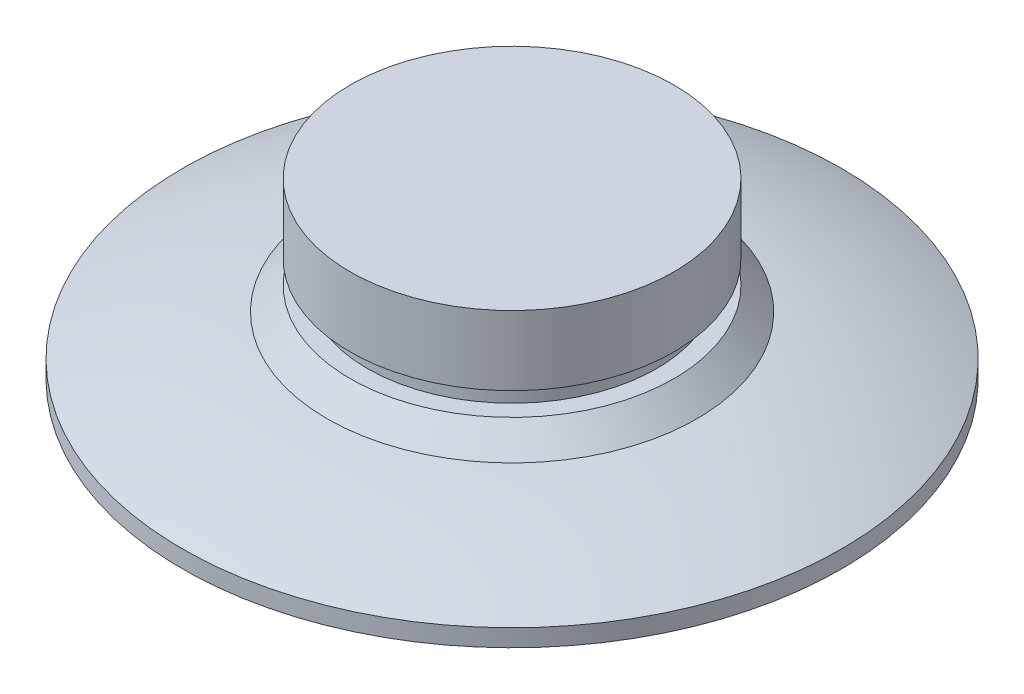
ISO-10303-21;
HEADER;
FILE_DESCRIPTION(('STEP AP214'),'2;1');
FILE_NAME('part.step','',(''),(''),'','','');
FILE_SCHEMA(('AUTOMOTIVE_DESIGN { 1 0 10303 214 1 1 1 1 }'));
ENDSEC;
DATA;
#1=APPLICATION_CONTEXT('core data for automotive mechanical design processes');
#2=APPLICATION_PROTOCOL_DEFINITION('international standard','automotive_design',2000,#1);
#3=PRODUCT_CONTEXT('',#1,'mechanical');
#4=PRODUCT('Part','Part','',(#3));
#5=PRODUCT_RELATED_PRODUCT_CATEGORY('part','',(#4));
#6=PRODUCT_DEFINITION_FORMATION('','',#4);
#7=PRODUCT_DEFINITION_CONTEXT('part definition',#1,'design');
#8=PRODUCT_DEFINITION('design','',#6,#7);
#9=PRODUCT_DEFINITION_SHAPE('','',#8);
#10=(LENGTH_UNIT() NAMED_UNIT(*) SI_UNIT(.MILLI.,.METRE.));
#11=(NAMED_UNIT(*) PLANE_ANGLE_UNIT() SI_UNIT($,.RADIAN.));
#12=(NAMED_UNIT(*) SI_UNIT($,.STERADIAN.) SOLID_ANGLE_UNIT());
#13=UNCERTAINTY_MEASURE_WITH_UNIT(LENGTH_MEASURE(1.E-05),#10,'distance_accuracy_value','');
#14=(GEOMETRIC_REPRESENTATION_CONTEXT(3) GLOBAL_UNCERTAINTY_ASSIGNED_CONTEXT((#13)) GLOBAL_UNIT_ASSIGNED_CONTEXT((#10,
#11,#12)) REPRESENTATION_CONTEXT('',''));
#15=CARTESIAN_POINT('',(0.,0.,0.));
#16=DIRECTION('',(0.,0.,1.));
#17=DIRECTION('',(1.,0.,0.));
#18=AXIS2_PLACEMENT_3D('',#15,#16,#17);
#19=CARTESIAN_POINT('',(0.,15.,0.));
#20=DIRECTION('',(0.,1.,0.));
#21=DIRECTION('',(0.,0.,1.));
#22=AXIS2_PLACEMENT_3D('',#19,#20,#21);
#23=PLANE('',#22);
#24=CARTESIAN_POINT('',(0.,15.,0.));
#25=DIRECTION('',(0.,-1.,0.));
#26=DIRECTION('',(0.,0.,-1.));
#27=AXIS2_PLACEMENT_3D('',#24,#25,#26);
#28=CIRCLE('',#27,14.);
#29=CARTESIAN_POINT('',(0.,15.,-14.));
#30=VERTEX_POINT('',#29);
#31=EDGE_CURVE('E10',#30,#30,#28,.T.);
#32=ORIENTED_EDGE('',*,*,#31,.F.);
#33=EDGE_LOOP('',(#32));
#34=FACE_BOUND('',#33,.T.);
#35=ADVANCED_FACE('F27',(#34),#23,.T.);
#36=CARTESIAN_POINT('',(0.,0.,0.));
#37=DIRECTION('',(0.,-1.,0.));
#38=DIRECTION('',(0.,0.,-1.));
#39=AXIS2_PLACEMENT_3D('',#36,#37,#38);
#40=CYLINDRICAL_SURFACE('',#39,14.);
#41=ORIENTED_EDGE('',*,*,#31,.T.);
#42=EDGE_LOOP('',(#41));
#43=FACE_BOUND('',#42,.T.);
#44=CARTESIAN_POINT('',(0.,9.,0.));
#45=DIRECTION('',(0.,-1.,0.));
#46=DIRECTION('',(0.,0.,-1.));
#47=AXIS2_PLACEMENT_3D('',#44,#45,#46);
#48=CIRCLE('',#47,14.);
#49=CARTESIAN_POINT('',(0.,9.,-14.));
#50=VERTEX_POINT('',#49);
#51=EDGE_CURVE('E33',#50,#50,#48,.T.);
#52=ORIENTED_EDGE('',*,*,#51,.F.);
#53=EDGE_LOOP('',(#52));
#54=FACE_BOUND('',#53,.T.);
#55=ADVANCED_FACE('F75',(#43,#54),#40,.T.);
#56=CARTESIAN_POINT('',(14.,9.,0.));
#57=DIRECTION('',(0.,-1.,0.));
#58=DIRECTION('',(0.,0.,-1.));
#59=AXIS2_PLACEMENT_3D('',#56,#57,#58);
#60=PLANE('',#59);
#61=ORIENTED_EDGE('',*,*,#51,.T.);
#62=EDGE_LOOP('',(#61));
#63=FACE_BOUND('',#62,.T.);
#64=CARTESIAN_POINT('',(0.,9.,0.));
#65=DIRECTION('',(0.,-1.,0.));
#66=DIRECTION('',(0.,0.,-1.));
#67=AXIS2_PLACEMENT_3D('',#64,#65,#66);
#68=CIRCLE('',#67,12.5);
#69=CARTESIAN_POINT('',(0.,9.,-12.5));
#70=VERTEX_POINT('',#69);
#71=EDGE_CURVE('E37',#70,#70,#68,.T.);
#72=ORIENTED_EDGE('',*,*,#71,.F.);
#73=EDGE_LOOP('',(#72));
#74=FACE_BOUND('',#73,.T.);
#75=ADVANCED_FACE('F80',(#63,#74),#60,.T.);
#76=CARTESIAN_POINT('',(0.,0.,0.));
#77=DIRECTION('',(0.,-1.,0.));
#78=DIRECTION('',(0.,0.,-1.));
#79=AXIS2_PLACEMENT_3D('',#76,#77,#78);
#80=CYLINDRICAL_SURFACE('',#79,12.5);
#81=ORIENTED_EDGE('',*,*,#71,.T.);
#82=EDGE_LOOP('',(#81));
#83=FACE_BOUND('',#82,.T.);
#84=CARTESIAN_POINT('',(0.,7.,0.));
#85=DIRECTION('',(0.,-1.,0.));
#86=DIRECTION('',(0.,0.,-1.));
#87=AXIS2_PLACEMENT_3D('',#84,#85,#86);
#88=CIRCLE('',#87,12.5);
#89=CARTESIAN_POINT('',(0.,7.,-12.5));
#90=VERTEX_POINT('',#89);
#91=EDGE_CURVE('E41',#90,#90,#88,.T.);
#92=ORIENTED_EDGE('',*,*,#91,.F.);
#93=EDGE_LOOP('',(#92));
#94=FACE_BOUND('',#93,.T.);
#95=ADVANCED_FACE('F84',(#83,#94),#80,.T.);
#96=CARTESIAN_POINT('',(12.5,7.,0.));
#97=DIRECTION('',(0.,1.,0.));
#98=DIRECTION('',(0.,0.,1.));
#99=AXIS2_PLACEMENT_3D('',#96,#97,#98);
#100=PLANE('',#99);
#101=ORIENTED_EDGE('',*,*,#91,.T.);
#102=EDGE_LOOP('',(#101));
#103=FACE_BOUND('',#102,.T.);
#104=CARTESIAN_POINT('',(0.,7.,0.));
#105=DIRECTION('',(0.,-1.,0.));
#106=DIRECTION('',(0.,0.,-1.));
#107=AXIS2_PLACEMENT_3D('',#104,#105,#106);
#108=CIRCLE('',#107,14.);
#109=CARTESIAN_POINT('',(0.,7.,-14.));
#110=VERTEX_POINT('',#109);
#111=EDGE_CURVE('E46',#110,#110,#108,.T.);
#112=ORIENTED_EDGE('',*,*,#111,.F.);
#113=EDGE_LOOP('',(#112));
#114=FACE_BOUND('',#113,.T.);
#115=ADVANCED_FACE('F90',(#103,#114),#100,.T.);
#116=CARTESIAN_POINT('',(0.,5.,0.));
#117=DIRECTION('',(0.,-1.,0.));
#118=DIRECTION('',(0.,0.,-1.));
#119=AXIS2_PLACEMENT_3D('',#116,#117,#118);
#120=CONICAL_SURFACE('',#119,16.,0.785398163397451);
#121=ORIENTED_EDGE('',*,*,#111,.T.);
#122=EDGE_LOOP('',(#121));
#123=FACE_BOUND('',#122,.T.);
#124=CARTESIAN_POINT('',(0.,5.,0.));
#125=DIRECTION('',(0.,-1.,0.));
#126=DIRECTION('',(0.,0.,-1.));
#127=AXIS2_PLACEMENT_3D('',#124,#125,#126);
#128=CIRCLE('',#127,16.);
#129=CARTESIAN_POINT('',(0.,5.,-16.));
#130=VERTEX_POINT('',#129);
#131=EDGE_CURVE('E49',#130,#130,#128,.T.);
#132=ORIENTED_EDGE('',*,*,#131,.F.);
#133=EDGE_LOOP('',(#132));
#134=FACE_BOUND('',#133,.T.);
#135=ADVANCED_FACE('F71',(#123,#134),#120,.T.);
#136=CARTESIAN_POINT('',(0.,-40.1833737062762,0.));
#137=DIRECTION('',(0.,-1.,0.));
#138=DIRECTION('',(0.,0.,-1.));
#139=AXIS2_PLACEMENT_3D('',#136,#137,#138);
#140=DEGENERATE_TOROIDAL_SURFACE('',#139,10.0886553622427,45.56842388,.T.);
#141=ORIENTED_EDGE('',*,*,#131,.T.);
#142=EDGE_LOOP('',(#141));
#143=FACE_BOUND('',#142,.T.);
#144=CARTESIAN_POINT('',(0.,1.5,0.));
#145=DIRECTION('',(0.,-1.,0.));
#146=DIRECTION('',(0.,0.,-1.));
#147=AXIS2_PLACEMENT_3D('',#144,#145,#146);
#148=CIRCLE('',#147,28.5);
#149=CARTESIAN_POINT('',(0.,1.5,-28.5));
#150=VERTEX_POINT('',#149);
#151=EDGE_CURVE('E52',#150,#150,#148,.T.);
#152=ORIENTED_EDGE('',*,*,#151,.F.);
#153=EDGE_LOOP('',(#152));
#154=FACE_BOUND('',#153,.T.);
#155=ADVANCED_FACE('F63',(#143,#154),#140,.T.);
#156=CARTESIAN_POINT('',(0.,0.,0.));
#157=DIRECTION('',(0.,-1.,0.));
#158=DIRECTION('',(0.,0.,-1.));
#159=AXIS2_PLACEMENT_3D('',#156,#157,#158);
#160=CYLINDRICAL_SURFACE('',#159,28.5);
#161=ORIENTED_EDGE('',*,*,#151,.T.);
#162=EDGE_LOOP('',(#161));
#163=FACE_BOUND('',#162,.T.);
#164=CARTESIAN_POINT('',(0.,0.,0.));
#165=DIRECTION('',(0.,-1.,0.));
#166=DIRECTION('',(0.,0.,-1.));
#167=AXIS2_PLACEMENT_3D('',#164,#165,#166);
#168=CIRCLE('',#167,28.5);
#169=CARTESIAN_POINT('',(0.,0.,-28.5));
#170=VERTEX_POINT('',#169);
#171=EDGE_CURVE('E55',#170,#170,#168,.T.);
#172=ORIENTED_EDGE('',*,*,#171,.F.);
#173=EDGE_LOOP('',(#172));
#174=FACE_BOUND('',#173,.T.);
#175=ADVANCED_FACE('F61',(#163,#174),#160,.T.);
#176=CARTESIAN_POINT('',(0.,0.,0.));
#177=DIRECTION('',(0.,-1.,0.));
#178=DIRECTION('',(0.,0.,-1.));
#179=AXIS2_PLACEMENT_3D('',#176,#177,#178);
#180=PLANE('',#179);
#181=ORIENTED_EDGE('',*,*,#171,.T.);
#182=EDGE_LOOP('',(#181));
#183=FACE_BOUND('',#182,.T.);
#184=ADVANCED_FACE('F59',(#183),#180,.T.);
#185=CLOSED_SHELL('',(#35,#55,#75,#95,#115,#135,#155,#175,#184));
#186=MANIFOLD_SOLID_BREP('B2',#185);
#187=ADVANCED_BREP_SHAPE_REPRESENTATION('',(#18,#186),#14);
#188=SHAPE_DEFINITION_REPRESENTATION(#9,#187);
ENDSEC;
END-ISO-10303-21;
